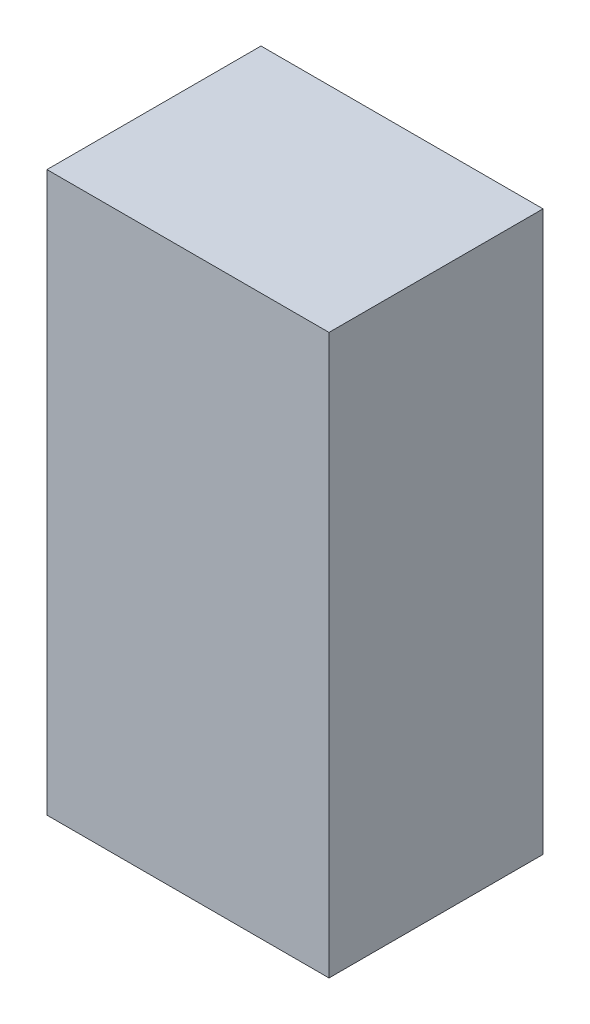
ISO-10303-21;
HEADER;
FILE_DESCRIPTION(('STEP AP214'),'2;1');
FILE_NAME('part.step','',(''),(''),'','','');
FILE_SCHEMA(('AUTOMOTIVE_DESIGN { 1 0 10303 214 1 1 1 1 }'));
ENDSEC;
DATA;
#1=APPLICATION_CONTEXT('core data for automotive mechanical design processes');
#2=APPLICATION_PROTOCOL_DEFINITION('international standard','automotive_design',2000,#1);
#3=PRODUCT_CONTEXT('',#1,'mechanical');
#4=PRODUCT('Part','Part','',(#3));
#5=PRODUCT_RELATED_PRODUCT_CATEGORY('part','',(#4));
#6=PRODUCT_DEFINITION_FORMATION('','',#4);
#7=PRODUCT_DEFINITION_CONTEXT('part definition',#1,'design');
#8=PRODUCT_DEFINITION('design','',#6,#7);
#9=PRODUCT_DEFINITION_SHAPE('','',#8);
#10=(LENGTH_UNIT() NAMED_UNIT(*) SI_UNIT(.MILLI.,.METRE.));
#11=(NAMED_UNIT(*) PLANE_ANGLE_UNIT() SI_UNIT($,.RADIAN.));
#12=(NAMED_UNIT(*) SI_UNIT($,.STERADIAN.) SOLID_ANGLE_UNIT());
#13=UNCERTAINTY_MEASURE_WITH_UNIT(LENGTH_MEASURE(1.E-05),#10,'distance_accuracy_value','');
#14=(GEOMETRIC_REPRESENTATION_CONTEXT(3) GLOBAL_UNCERTAINTY_ASSIGNED_CONTEXT((#13)) GLOBAL_UNIT_ASSIGNED_CONTEXT((#10,
#11,#12)) REPRESENTATION_CONTEXT('',''));
#15=CARTESIAN_POINT('',(0.,0.,0.));
#16=DIRECTION('',(0.,0.,1.));
#17=DIRECTION('',(1.,0.,0.));
#18=AXIS2_PLACEMENT_3D('',#15,#16,#17);
#19=CARTESIAN_POINT('',(0.,0.,0.));
#20=DIRECTION('',(0.,0.,1.));
#21=DIRECTION('',(1.,0.,0.));
#22=AXIS2_PLACEMENT_3D('',#19,#20,#21);
#23=PLANE('',#22);
#24=DIRECTION('',(1.,0.,0.));
#25=VECTOR('',#24,1.);
#26=CARTESIAN_POINT('',(-85.,-168.5,0.));
#27=LINE('',#26,#25);
#28=CARTESIAN_POINT('',(-85.,-168.5,0.));
#29=VERTEX_POINT('',#28);
#30=CARTESIAN_POINT('',(85.,-168.5,0.));
#31=VERTEX_POINT('',#30);
#32=EDGE_CURVE('E143',#29,#31,#27,.T.);
#33=ORIENTED_EDGE('',*,*,#32,.F.);
#34=DIRECTION('',(0.,1.,0.));
#35=VECTOR('',#34,1.);
#36=CARTESIAN_POINT('',(-85.,-168.5,0.));
#37=LINE('',#36,#35);
#38=CARTESIAN_POINT('',(-85.,168.5,0.));
#39=VERTEX_POINT('',#38);
#40=EDGE_CURVE('E157',#29,#39,#37,.T.);
#41=ORIENTED_EDGE('',*,*,#40,.T.);
#42=DIRECTION('',(1.,0.,0.));
#43=VECTOR('',#42,1.);
#44=CARTESIAN_POINT('',(-85.,168.5,0.));
#45=LINE('',#44,#43);
#46=CARTESIAN_POINT('',(85.,168.5,0.));
#47=VERTEX_POINT('',#46);
#48=EDGE_CURVE('E170',#39,#47,#45,.T.);
#49=ORIENTED_EDGE('',*,*,#48,.T.);
#50=DIRECTION('',(0.,1.,0.));
#51=VECTOR('',#50,1.);
#52=CARTESIAN_POINT('',(85.,-168.5,0.));
#53=LINE('',#52,#51);
#54=EDGE_CURVE('E148',#31,#47,#53,.T.);
#55=ORIENTED_EDGE('',*,*,#54,.F.);
#56=EDGE_LOOP('',(#33,#41,#49,#55));
#57=FACE_BOUND('',#56,.T.);
#58=DIRECTION('',(1.,0.,0.));
#59=VECTOR('',#58,1.);
#60=CARTESIAN_POINT('',(0.,-158.5,0.));
#61=LINE('',#60,#59);
#62=CARTESIAN_POINT('',(-75.,-158.5,0.));
#63=VERTEX_POINT('',#62);
#64=CARTESIAN_POINT('',(75.,-158.5,0.));
#65=VERTEX_POINT('',#64);
#66=EDGE_CURVE('E61',#63,#65,#61,.T.);
#67=ORIENTED_EDGE('',*,*,#66,.T.);
#68=DIRECTION('',(0.,1.,0.));
#69=VECTOR('',#68,1.);
#70=CARTESIAN_POINT('',(75.,0.,0.));
#71=LINE('',#70,#69);
#72=CARTESIAN_POINT('',(75.,158.5,0.));
#73=VERTEX_POINT('',#72);
#74=EDGE_CURVE('E141',#65,#73,#71,.T.);
#75=ORIENTED_EDGE('',*,*,#74,.T.);
#76=DIRECTION('',(1.,0.,0.));
#77=VECTOR('',#76,1.);
#78=CARTESIAN_POINT('',(0.,158.5,0.));
#79=LINE('',#78,#77);
#80=CARTESIAN_POINT('',(-75.,158.5,0.));
#81=VERTEX_POINT('',#80);
#82=EDGE_CURVE('E278',#81,#73,#79,.T.);
#83=ORIENTED_EDGE('',*,*,#82,.F.);
#84=DIRECTION('',(0.,1.,0.));
#85=VECTOR('',#84,1.);
#86=CARTESIAN_POINT('',(-75.,0.,0.));
#87=LINE('',#86,#85);
#88=EDGE_CURVE('E137',#63,#81,#87,.T.);
#89=ORIENTED_EDGE('',*,*,#88,.F.);
#90=EDGE_LOOP('',(#67,#75,#83,#89));
#91=FACE_BOUND('',#90,.T.);
#92=ADVANCED_FACE('F45',(#57,#91),#23,.F.);
#93=CARTESIAN_POINT('',(-85.,-168.5,129.));
#94=DIRECTION('',(0.,1.,0.));
#95=DIRECTION('',(0.,0.,1.));
#96=AXIS2_PLACEMENT_3D('',#93,#94,#95);
#97=PLANE('',#96);
#98=ORIENTED_EDGE('',*,*,#32,.T.);
#99=DIRECTION('',(0.,0.,-1.));
#100=VECTOR('',#99,1.);
#101=CARTESIAN_POINT('',(85.,-168.5,129.));
#102=LINE('',#101,#100);
#103=CARTESIAN_POINT('',(85.,-168.5,129.));
#104=VERTEX_POINT('',#103);
#105=EDGE_CURVE('E11',#104,#31,#102,.T.);
#106=ORIENTED_EDGE('',*,*,#105,.F.);
#107=DIRECTION('',(1.,0.,0.));
#108=VECTOR('',#107,1.);
#109=CARTESIAN_POINT('',(-85.,-168.5,129.));
#110=LINE('',#109,#108);
#111=CARTESIAN_POINT('',(-85.,-168.5,129.));
#112=VERTEX_POINT('',#111);
#113=EDGE_CURVE('E154',#112,#104,#110,.T.);
#114=ORIENTED_EDGE('',*,*,#113,.F.);
#115=DIRECTION('',(0.,0.,-1.));
#116=VECTOR('',#115,1.);
#117=CARTESIAN_POINT('',(-85.,-168.5,129.));
#118=LINE('',#117,#116);
#119=EDGE_CURVE('E70',#112,#29,#118,.T.);
#120=ORIENTED_EDGE('',*,*,#119,.T.);
#121=EDGE_LOOP('',(#98,#106,#114,#120));
#122=FACE_BOUND('',#121,.T.);
#123=ADVANCED_FACE('F47',(#122),#97,.F.);
#124=CARTESIAN_POINT('',(85.,-168.5,129.));
#125=DIRECTION('',(-1.,0.,0.));
#126=DIRECTION('',(0.,0.,1.));
#127=AXIS2_PLACEMENT_3D('',#124,#125,#126);
#128=PLANE('',#127);
#129=ORIENTED_EDGE('',*,*,#54,.T.);
#130=DIRECTION('',(0.,0.,-1.));
#131=VECTOR('',#130,1.);
#132=CARTESIAN_POINT('',(85.,168.5,129.));
#133=LINE('',#132,#131);
#134=CARTESIAN_POINT('',(85.,168.5,129.));
#135=VERTEX_POINT('',#134);
#136=EDGE_CURVE('E54',#135,#47,#133,.T.);
#137=ORIENTED_EDGE('',*,*,#136,.F.);
#138=DIRECTION('',(0.,1.,0.));
#139=VECTOR('',#138,1.);
#140=CARTESIAN_POINT('',(85.,-168.5,129.));
#141=LINE('',#140,#139);
#142=EDGE_CURVE('E96',#104,#135,#141,.T.);
#143=ORIENTED_EDGE('',*,*,#142,.F.);
#144=ORIENTED_EDGE('',*,*,#105,.T.);
#145=EDGE_LOOP('',(#129,#137,#143,#144));
#146=FACE_BOUND('',#145,.T.);
#147=ADVANCED_FACE('F186',(#146),#128,.F.);
#148=CARTESIAN_POINT('',(-85.,168.5,129.));
#149=DIRECTION('',(0.,1.,0.));
#150=DIRECTION('',(0.,0.,1.));
#151=AXIS2_PLACEMENT_3D('',#148,#149,#150);
#152=PLANE('',#151);
#153=ORIENTED_EDGE('',*,*,#48,.F.);
#154=DIRECTION('',(0.,0.,-1.));
#155=VECTOR('',#154,1.);
#156=CARTESIAN_POINT('',(-85.,168.5,129.));
#157=LINE('',#156,#155);
#158=CARTESIAN_POINT('',(-85.,168.5,129.));
#159=VERTEX_POINT('',#158);
#160=EDGE_CURVE('E179',#159,#39,#157,.T.);
#161=ORIENTED_EDGE('',*,*,#160,.F.);
#162=DIRECTION('',(1.,0.,0.));
#163=VECTOR('',#162,1.);
#164=CARTESIAN_POINT('',(-85.,168.5,129.));
#165=LINE('',#164,#163);
#166=EDGE_CURVE('E160',#159,#135,#165,.T.);
#167=ORIENTED_EDGE('',*,*,#166,.T.);
#168=ORIENTED_EDGE('',*,*,#136,.T.);
#169=EDGE_LOOP('',(#153,#161,#167,#168));
#170=FACE_BOUND('',#169,.T.);
#171=ADVANCED_FACE('F184',(#170),#152,.T.);
#172=CARTESIAN_POINT('',(-85.,-168.5,129.));
#173=DIRECTION('',(-1.,0.,0.));
#174=DIRECTION('',(0.,0.,1.));
#175=AXIS2_PLACEMENT_3D('',#172,#173,#174);
#176=PLANE('',#175);
#177=ORIENTED_EDGE('',*,*,#40,.F.);
#178=ORIENTED_EDGE('',*,*,#119,.F.);
#179=DIRECTION('',(0.,1.,0.));
#180=VECTOR('',#179,1.);
#181=CARTESIAN_POINT('',(-85.,-168.5,129.));
#182=LINE('',#181,#180);
#183=EDGE_CURVE('E164',#112,#159,#182,.T.);
#184=ORIENTED_EDGE('',*,*,#183,.T.);
#185=ORIENTED_EDGE('',*,*,#160,.T.);
#186=EDGE_LOOP('',(#177,#178,#184,#185));
#187=FACE_BOUND('',#186,.T.);
#188=ADVANCED_FACE('F190',(#187),#176,.T.);
#189=CARTESIAN_POINT('',(0.,0.,129.));
#190=DIRECTION('',(0.,0.,1.));
#191=DIRECTION('',(1.,0.,0.));
#192=AXIS2_PLACEMENT_3D('',#189,#190,#191);
#193=PLANE('',#192);
#194=ORIENTED_EDGE('',*,*,#113,.T.);
#195=ORIENTED_EDGE('',*,*,#142,.T.);
#196=ORIENTED_EDGE('',*,*,#166,.F.);
#197=ORIENTED_EDGE('',*,*,#183,.F.);
#198=EDGE_LOOP('',(#194,#195,#196,#197));
#199=FACE_BOUND('',#198,.T.);
#200=ADVANCED_FACE('F193',(#199),#193,.T.);
#201=CARTESIAN_POINT('',(0.,-158.5,128.));
#202=DIRECTION('',(0.,1.,0.));
#203=DIRECTION('',(0.,0.,1.));
#204=AXIS2_PLACEMENT_3D('',#201,#202,#203);
#205=PLANE('',#204);
#206=ORIENTED_EDGE('',*,*,#66,.F.);
#207=DIRECTION('',(0.,0.,-1.));
#208=VECTOR('',#207,1.);
#209=CARTESIAN_POINT('',(-75.,-158.5,128.));
#210=LINE('',#209,#208);
#211=CARTESIAN_POINT('',(-75.,-158.5,128.));
#212=VERTEX_POINT('',#211);
#213=EDGE_CURVE('E135',#212,#63,#210,.T.);
#214=ORIENTED_EDGE('',*,*,#213,.F.);
#215=DIRECTION('',(1.,0.,0.));
#216=VECTOR('',#215,1.);
#217=CARTESIAN_POINT('',(0.,-158.5,128.));
#218=LINE('',#217,#216);
#219=CARTESIAN_POINT('',(75.,-158.5,128.));
#220=VERTEX_POINT('',#219);
#221=EDGE_CURVE('E124',#212,#220,#218,.T.);
#222=ORIENTED_EDGE('',*,*,#221,.T.);
#223=DIRECTION('',(0.,0.,-1.));
#224=VECTOR('',#223,1.);
#225=CARTESIAN_POINT('',(75.,-158.5,128.));
#226=LINE('',#225,#224);
#227=EDGE_CURVE('E134',#220,#65,#226,.T.);
#228=ORIENTED_EDGE('',*,*,#227,.T.);
#229=EDGE_LOOP('',(#206,#214,#222,#228));
#230=FACE_BOUND('',#229,.T.);
#231=ADVANCED_FACE('F133',(#230),#205,.T.);
#232=CARTESIAN_POINT('',(75.,0.,128.));
#233=DIRECTION('',(-1.,0.,0.));
#234=DIRECTION('',(0.,0.,1.));
#235=AXIS2_PLACEMENT_3D('',#232,#233,#234);
#236=PLANE('',#235);
#237=ORIENTED_EDGE('',*,*,#74,.F.);
#238=ORIENTED_EDGE('',*,*,#227,.F.);
#239=DIRECTION('',(0.,1.,0.));
#240=VECTOR('',#239,1.);
#241=CARTESIAN_POINT('',(75.,0.,128.));
#242=LINE('',#241,#240);
#243=CARTESIAN_POINT('',(75.,158.5,128.));
#244=VERTEX_POINT('',#243);
#245=EDGE_CURVE('E120',#220,#244,#242,.T.);
#246=ORIENTED_EDGE('',*,*,#245,.T.);
#247=DIRECTION('',(0.,0.,-1.));
#248=VECTOR('',#247,1.);
#249=CARTESIAN_POINT('',(75.,158.5,128.));
#250=LINE('',#249,#248);
#251=EDGE_CURVE('E144',#244,#73,#250,.T.);
#252=ORIENTED_EDGE('',*,*,#251,.T.);
#253=EDGE_LOOP('',(#237,#238,#246,#252));
#254=FACE_BOUND('',#253,.T.);
#255=ADVANCED_FACE('F139',(#254),#236,.T.);
#256=CARTESIAN_POINT('',(0.,158.5,128.));
#257=DIRECTION('',(0.,1.,0.));
#258=DIRECTION('',(0.,0.,1.));
#259=AXIS2_PLACEMENT_3D('',#256,#257,#258);
#260=PLANE('',#259);
#261=ORIENTED_EDGE('',*,*,#82,.T.);
#262=ORIENTED_EDGE('',*,*,#251,.F.);
#263=DIRECTION('',(1.,0.,0.));
#264=VECTOR('',#263,1.);
#265=CARTESIAN_POINT('',(0.,158.5,128.));
#266=LINE('',#265,#264);
#267=CARTESIAN_POINT('',(-75.,158.5,128.));
#268=VERTEX_POINT('',#267);
#269=EDGE_CURVE('E127',#268,#244,#266,.T.);
#270=ORIENTED_EDGE('',*,*,#269,.F.);
#271=DIRECTION('',(0.,0.,-1.));
#272=VECTOR('',#271,1.);
#273=CARTESIAN_POINT('',(-75.,158.5,128.));
#274=LINE('',#273,#272);
#275=EDGE_CURVE('E150',#268,#81,#274,.T.);
#276=ORIENTED_EDGE('',*,*,#275,.T.);
#277=EDGE_LOOP('',(#261,#262,#270,#276));
#278=FACE_BOUND('',#277,.T.);
#279=ADVANCED_FACE('F244',(#278),#260,.F.);
#280=CARTESIAN_POINT('',(-75.,0.,128.));
#281=DIRECTION('',(-1.,0.,0.));
#282=DIRECTION('',(0.,0.,1.));
#283=AXIS2_PLACEMENT_3D('',#280,#281,#282);
#284=PLANE('',#283);
#285=ORIENTED_EDGE('',*,*,#88,.T.);
#286=ORIENTED_EDGE('',*,*,#275,.F.);
#287=DIRECTION('',(0.,1.,0.));
#288=VECTOR('',#287,1.);
#289=CARTESIAN_POINT('',(-75.,0.,128.));
#290=LINE('',#289,#288);
#291=EDGE_CURVE('E288',#212,#268,#290,.T.);
#292=ORIENTED_EDGE('',*,*,#291,.F.);
#293=ORIENTED_EDGE('',*,*,#213,.T.);
#294=EDGE_LOOP('',(#285,#286,#292,#293));
#295=FACE_BOUND('',#294,.T.);
#296=ADVANCED_FACE('F253',(#295),#284,.F.);
#297=CARTESIAN_POINT('',(0.,0.,128.));
#298=DIRECTION('',(0.,0.,1.));
#299=DIRECTION('',(1.,0.,0.));
#300=AXIS2_PLACEMENT_3D('',#297,#298,#299);
#301=PLANE('',#300);
#302=ORIENTED_EDGE('',*,*,#221,.F.);
#303=ORIENTED_EDGE('',*,*,#291,.T.);
#304=ORIENTED_EDGE('',*,*,#269,.T.);
#305=ORIENTED_EDGE('',*,*,#245,.F.);
#306=EDGE_LOOP('',(#302,#303,#304,#305));
#307=FACE_BOUND('',#306,.T.);
#308=ADVANCED_FACE('F122',(#307),#301,.F.);
#309=CLOSED_SHELL('',(#92,#123,#147,#171,#188,#200,#231,#255,#279,#296,#308));
#310=MANIFOLD_SOLID_BREP('B2',#309);
#311=ADVANCED_BREP_SHAPE_REPRESENTATION('',(#18,#310),#14);
#312=SHAPE_DEFINITION_REPRESENTATION(#9,#311);
ENDSEC;
END-ISO-10303-21;
